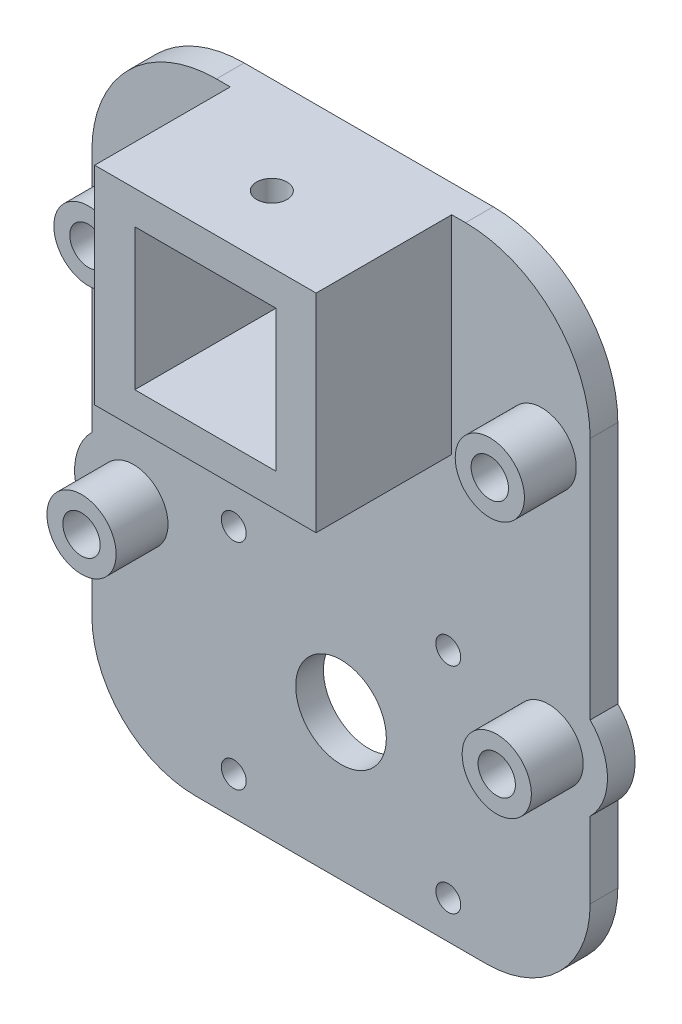
ISO-10303-21;
HEADER;
FILE_DESCRIPTION(('STEP AP214'),'2;1');
FILE_NAME('part.step','',(''),(''),'','','');
FILE_SCHEMA(('AUTOMOTIVE_DESIGN { 1 0 10303 214 1 1 1 1 }'));
ENDSEC;
DATA;
#1=APPLICATION_CONTEXT('core data for automotive mechanical design processes');
#2=APPLICATION_PROTOCOL_DEFINITION('international standard','automotive_design',2000,#1);
#3=PRODUCT_CONTEXT('',#1,'mechanical');
#4=PRODUCT('Part','Part','',(#3));
#5=PRODUCT_RELATED_PRODUCT_CATEGORY('part','',(#4));
#6=PRODUCT_DEFINITION_FORMATION('','',#4);
#7=PRODUCT_DEFINITION_CONTEXT('part definition',#1,'design');
#8=PRODUCT_DEFINITION('design','',#6,#7);
#9=PRODUCT_DEFINITION_SHAPE('','',#8);
#10=(LENGTH_UNIT() NAMED_UNIT(*) SI_UNIT(.MILLI.,.METRE.));
#11=(NAMED_UNIT(*) PLANE_ANGLE_UNIT() SI_UNIT($,.RADIAN.));
#12=(NAMED_UNIT(*) SI_UNIT($,.STERADIAN.) SOLID_ANGLE_UNIT());
#13=UNCERTAINTY_MEASURE_WITH_UNIT(LENGTH_MEASURE(1.E-05),#10,'distance_accuracy_value','');
#14=(GEOMETRIC_REPRESENTATION_CONTEXT(3) GLOBAL_UNCERTAINTY_ASSIGNED_CONTEXT((#13)) GLOBAL_UNIT_ASSIGNED_CONTEXT((#10,
#11,#12)) REPRESENTATION_CONTEXT('',''));
#15=CARTESIAN_POINT('',(0.,0.,0.));
#16=DIRECTION('',(0.,0.,1.));
#17=DIRECTION('',(1.,0.,0.));
#18=AXIS2_PLACEMENT_3D('',#15,#16,#17);
#19=CARTESIAN_POINT('',(0.,0.,4.));
#20=DIRECTION('',(0.,0.,1.));
#21=DIRECTION('',(1.,0.,0.));
#22=AXIS2_PLACEMENT_3D('',#19,#20,#21);
#23=PLANE('',#22);
#24=CARTESIAN_POINT('',(30.,-8.49999999999995,4.));
#25=DIRECTION('',(0.,0.,1.));
#26=DIRECTION('',(-1.,0.,0.));
#27=AXIS2_PLACEMENT_3D('',#24,#25,#26);
#28=CIRCLE('',#27,5.);
#29=CARTESIAN_POINT('',(25.,-8.49999999999995,4.));
#30=VERTEX_POINT('',#29);
#31=EDGE_CURVE('E401',#30,#30,#28,.T.);
#32=ORIENTED_EDGE('',*,*,#31,.F.);
#33=EDGE_LOOP('',(#32));
#34=FACE_BOUND('',#33,.T.);
#35=CARTESIAN_POINT('',(-29.,28.1,4.));
#36=DIRECTION('',(0.,0.,1.));
#37=DIRECTION('',(1.,0.,0.));
#38=AXIS2_PLACEMENT_3D('',#35,#36,#37);
#39=CIRCLE('',#38,5.);
#40=CARTESIAN_POINT('',(-24.,28.1,4.));
#41=VERTEX_POINT('',#40);
#42=EDGE_CURVE('E383',#41,#41,#39,.T.);
#43=ORIENTED_EDGE('',*,*,#42,.F.);
#44=EDGE_LOOP('',(#43));
#45=FACE_BOUND('',#44,.T.);
#46=DIRECTION('',(0.,-1.,0.));
#47=VECTOR('',#46,1.);
#48=CARTESIAN_POINT('',(-16.0000000000035,0.,4.));
#49=LINE('',#48,#47);
#50=CARTESIAN_POINT('',(-16.0000000000035,50.75,4.));
#51=VERTEX_POINT('',#50);
#52=CARTESIAN_POINT('',(-16.0000000000035,20.75,4.));
#53=VERTEX_POINT('',#52);
#54=EDGE_CURVE('E65',#51,#53,#49,.T.);
#55=ORIENTED_EDGE('',*,*,#54,.F.);
#56=DIRECTION('',(1.,0.,0.));
#57=VECTOR('',#56,1.);
#58=CARTESIAN_POINT('',(0.,50.75,4.));
#59=LINE('',#58,#57);
#60=CARTESIAN_POINT('',(-18.,50.75,4.));
#61=VERTEX_POINT('',#60);
#62=EDGE_CURVE('E317',#61,#51,#59,.T.);
#63=ORIENTED_EDGE('',*,*,#62,.F.);
#64=CARTESIAN_POINT('',(-18.,32.75,4.));
#65=DIRECTION('',(0.,0.,1.));
#66=DIRECTION('',(1.,0.,0.));
#67=AXIS2_PLACEMENT_3D('',#64,#65,#66);
#68=CIRCLE('',#67,18.);
#69=CARTESIAN_POINT('',(-36.,32.75,4.));
#70=VERTEX_POINT('',#69);
#71=EDGE_CURVE('E188',#61,#70,#68,.T.);
#72=ORIENTED_EDGE('',*,*,#71,.T.);
#73=DIRECTION('',(0.,-1.,0.));
#74=VECTOR('',#73,1.);
#75=CARTESIAN_POINT('',(-36.,0.,4.));
#76=LINE('',#75,#74);
#77=CARTESIAN_POINT('',(-36.,-2.47920271060388,4.));
#78=VERTEX_POINT('',#77);
#79=EDGE_CURVE('E180',#70,#78,#76,.T.);
#80=ORIENTED_EDGE('',*,*,#79,.T.);
#81=CARTESIAN_POINT('',(-30.,-8.49999999999995,4.));
#82=DIRECTION('',(0.,0.,1.));
#83=DIRECTION('',(1.,0.,0.));
#84=AXIS2_PLACEMENT_3D('',#81,#82,#83);
#85=CIRCLE('',#84,8.49999999999995);
#86=CARTESIAN_POINT('',(-36.,-14.520797289396,4.));
#87=VERTEX_POINT('',#86);
#88=EDGE_CURVE('E184',#78,#87,#85,.T.);
#89=ORIENTED_EDGE('',*,*,#88,.T.);
#90=CARTESIAN_POINT('',(-36.,-25.4999999999999,4.));
#91=VERTEX_POINT('',#90);
#92=EDGE_CURVE('E87',#87,#91,#76,.T.);
#93=ORIENTED_EDGE('',*,*,#92,.T.);
#94=CARTESIAN_POINT('',(-21.,-25.4999999999999,4.));
#95=DIRECTION('',(0.,0.,1.));
#96=DIRECTION('',(1.,0.,0.));
#97=AXIS2_PLACEMENT_3D('',#94,#95,#96);
#98=CIRCLE('',#97,15.);
#99=CARTESIAN_POINT('',(-20.9999999999965,-40.4999999999999,4.));
#100=VERTEX_POINT('',#99);
#101=EDGE_CURVE('E291',#91,#100,#98,.T.);
#102=ORIENTED_EDGE('',*,*,#101,.T.);
#103=DIRECTION('',(1.,0.,0.));
#104=VECTOR('',#103,1.);
#105=CARTESIAN_POINT('',(0.,-40.4999999999999,4.));
#106=LINE('',#105,#104);
#107=CARTESIAN_POINT('',(21.0000000000035,-40.4999999999999,4.));
#108=VERTEX_POINT('',#107);
#109=EDGE_CURVE('E153',#100,#108,#106,.T.);
#110=ORIENTED_EDGE('',*,*,#109,.T.);
#111=CARTESIAN_POINT('',(21.,-25.4999999999999,4.));
#112=DIRECTION('',(0.,0.,1.));
#113=DIRECTION('',(1.,0.,0.));
#114=AXIS2_PLACEMENT_3D('',#111,#112,#113);
#115=CIRCLE('',#114,15.);
#116=CARTESIAN_POINT('',(36.,-25.4999999999999,4.));
#117=VERTEX_POINT('',#116);
#118=EDGE_CURVE('E336',#117,#108,#115,.F.);
#119=ORIENTED_EDGE('',*,*,#118,.F.);
#120=DIRECTION('',(0.,-1.,0.));
#121=VECTOR('',#120,1.);
#122=CARTESIAN_POINT('',(36.,0.,4.));
#123=LINE('',#122,#121);
#124=CARTESIAN_POINT('',(36.,-14.520797289396,4.));
#125=VERTEX_POINT('',#124);
#126=EDGE_CURVE('E333',#125,#117,#123,.T.);
#127=ORIENTED_EDGE('',*,*,#126,.F.);
#128=CARTESIAN_POINT('',(30.,-8.49999999999995,4.));
#129=DIRECTION('',(0.,0.,1.));
#130=DIRECTION('',(1.,0.,0.));
#131=AXIS2_PLACEMENT_3D('',#128,#129,#130);
#132=CIRCLE('',#131,8.49999999999995);
#133=CARTESIAN_POINT('',(36.,-2.47920271060388,4.));
#134=VERTEX_POINT('',#133);
#135=EDGE_CURVE('E330',#134,#125,#132,.F.);
#136=ORIENTED_EDGE('',*,*,#135,.F.);
#137=CARTESIAN_POINT('',(36.,32.75,4.));
#138=VERTEX_POINT('',#137);
#139=EDGE_CURVE('E329',#138,#134,#123,.T.);
#140=ORIENTED_EDGE('',*,*,#139,.F.);
#141=CARTESIAN_POINT('',(18.,32.75,4.));
#142=DIRECTION('',(0.,0.,1.));
#143=DIRECTION('',(1.,0.,0.));
#144=AXIS2_PLACEMENT_3D('',#141,#142,#143);
#145=CIRCLE('',#144,18.);
#146=CARTESIAN_POINT('',(18.,50.75,4.));
#147=VERTEX_POINT('',#146);
#148=EDGE_CURVE('E325',#147,#138,#145,.F.);
#149=ORIENTED_EDGE('',*,*,#148,.F.);
#150=CARTESIAN_POINT('',(15.9999999999965,50.75,4.));
#151=VERTEX_POINT('',#150);
#152=EDGE_CURVE('E321',#151,#147,#59,.T.);
#153=ORIENTED_EDGE('',*,*,#152,.F.);
#154=DIRECTION('',(0.,-1.,0.));
#155=VECTOR('',#154,1.);
#156=CARTESIAN_POINT('',(15.9999999999965,0.,4.));
#157=LINE('',#156,#155);
#158=CARTESIAN_POINT('',(15.9999999999965,20.75,4.));
#159=VERTEX_POINT('',#158);
#160=EDGE_CURVE('E348',#151,#159,#157,.T.);
#161=ORIENTED_EDGE('',*,*,#160,.T.);
#162=DIRECTION('',(-1.,0.,0.));
#163=VECTOR('',#162,1.);
#164=CARTESIAN_POINT('',(0.,20.75,4.));
#165=LINE('',#164,#163);
#166=EDGE_CURVE('E346',#159,#53,#165,.T.);
#167=ORIENTED_EDGE('',*,*,#166,.T.);
#168=EDGE_LOOP('',(#55,#63,#72,#80,#89,#93,#102,#110,#119,#127,#136,#140,#149,#153,#161,#167));
#169=FACE_BOUND('',#168,.T.);
#170=CARTESIAN_POINT('',(-15.4999999999965,-3.99999999999994,4.));
#171=DIRECTION('',(0.,0.,1.));
#172=DIRECTION('',(1.,0.,0.));
#173=AXIS2_PLACEMENT_3D('',#170,#171,#172);
#174=CIRCLE('',#173,1.8);
#175=CARTESIAN_POINT('',(-13.6999999999965,-3.99999999999994,4.));
#176=VERTEX_POINT('',#175);
#177=EDGE_CURVE('E206',#176,#176,#174,.T.);
#178=ORIENTED_EDGE('',*,*,#177,.F.);
#179=EDGE_LOOP('',(#178));
#180=FACE_BOUND('',#179,.T.);
#181=CARTESIAN_POINT('',(-15.4999999999965,-35.,4.));
#182=DIRECTION('',(0.,0.,1.));
#183=DIRECTION('',(1.,0.,0.));
#184=AXIS2_PLACEMENT_3D('',#181,#182,#183);
#185=CIRCLE('',#184,1.8);
#186=CARTESIAN_POINT('',(-13.6999999999965,-35.,4.));
#187=VERTEX_POINT('',#186);
#188=EDGE_CURVE('E211',#187,#187,#185,.T.);
#189=ORIENTED_EDGE('',*,*,#188,.F.);
#190=EDGE_LOOP('',(#189));
#191=FACE_BOUND('',#190,.T.);
#192=CARTESIAN_POINT('',(15.5000000000035,-34.9999999999999,4.));
#193=DIRECTION('',(0.,0.,1.));
#194=DIRECTION('',(1.,0.,0.));
#195=AXIS2_PLACEMENT_3D('',#192,#193,#194);
#196=CIRCLE('',#195,1.8);
#197=CARTESIAN_POINT('',(17.3000000000035,-34.9999999999999,4.));
#198=VERTEX_POINT('',#197);
#199=EDGE_CURVE('E214',#198,#198,#196,.T.);
#200=ORIENTED_EDGE('',*,*,#199,.F.);
#201=EDGE_LOOP('',(#200));
#202=FACE_BOUND('',#201,.T.);
#203=CARTESIAN_POINT('',(15.5000000000035,-3.99999999999994,4.));
#204=DIRECTION('',(0.,0.,1.));
#205=DIRECTION('',(1.,0.,0.));
#206=AXIS2_PLACEMENT_3D('',#203,#204,#205);
#207=CIRCLE('',#206,1.8);
#208=CARTESIAN_POINT('',(17.3000000000035,-3.99999999999994,4.));
#209=VERTEX_POINT('',#208);
#210=EDGE_CURVE('E217',#209,#209,#207,.T.);
#211=ORIENTED_EDGE('',*,*,#210,.F.);
#212=EDGE_LOOP('',(#211));
#213=FACE_BOUND('',#212,.T.);
#214=CARTESIAN_POINT('',(3.49145625605507E-12,-19.4999999999999,4.));
#215=DIRECTION('',(0.,0.,1.));
#216=DIRECTION('',(1.,0.,0.));
#217=AXIS2_PLACEMENT_3D('',#214,#215,#216);
#218=CIRCLE('',#217,6.55);
#219=CARTESIAN_POINT('',(6.55000000000349,-19.4999999999999,4.));
#220=VERTEX_POINT('',#219);
#221=EDGE_CURVE('E220',#220,#220,#218,.T.);
#222=ORIENTED_EDGE('',*,*,#221,.F.);
#223=EDGE_LOOP('',(#222));
#224=FACE_BOUND('',#223,.T.);
#225=CARTESIAN_POINT('',(-30.,-8.49999999999995,4.));
#226=DIRECTION('',(0.,0.,1.));
#227=DIRECTION('',(1.,0.,0.));
#228=AXIS2_PLACEMENT_3D('',#225,#226,#227);
#229=CIRCLE('',#228,5.);
#230=CARTESIAN_POINT('',(-25.,-8.49999999999995,4.));
#231=VERTEX_POINT('',#230);
#232=EDGE_CURVE('E392',#231,#231,#229,.T.);
#233=ORIENTED_EDGE('',*,*,#232,.F.);
#234=EDGE_LOOP('',(#233));
#235=FACE_BOUND('',#234,.T.);
#236=CARTESIAN_POINT('',(29.,28.1,4.));
#237=DIRECTION('',(0.,0.,1.));
#238=DIRECTION('',(-1.,0.,0.));
#239=AXIS2_PLACEMENT_3D('',#236,#237,#238);
#240=CIRCLE('',#239,5.00000000000002);
#241=CARTESIAN_POINT('',(24.,28.1,4.));
#242=VERTEX_POINT('',#241);
#243=EDGE_CURVE('E410',#242,#242,#240,.T.);
#244=ORIENTED_EDGE('',*,*,#243,.F.);
#245=EDGE_LOOP('',(#244));
#246=FACE_BOUND('',#245,.T.);
#247=ADVANCED_FACE('F61',(#34,#45,#169,#180,#191,#202,#213,#224,#235,#246),#23,.T.);
#248=CARTESIAN_POINT('',(10.2,0.,4.));
#249=DIRECTION('',(-1.,0.,0.));
#250=DIRECTION('',(0.,0.,1.));
#251=AXIS2_PLACEMENT_3D('',#248,#249,#250);
#252=PLANE('',#251);
#253=DIRECTION('',(0.,1.,0.));
#254=VECTOR('',#253,1.);
#255=CARTESIAN_POINT('',(10.2,0.,0.));
#256=LINE('',#255,#254);
#257=CARTESIAN_POINT('',(10.2,25.55,0.));
#258=VERTEX_POINT('',#257);
#259=CARTESIAN_POINT('',(10.2,45.95,0.));
#260=VERTEX_POINT('',#259);
#261=EDGE_CURVE('E253',#258,#260,#256,.T.);
#262=ORIENTED_EDGE('',*,*,#261,.F.);
#263=DIRECTION('',(0.,0.,-1.));
#264=VECTOR('',#263,1.);
#265=CARTESIAN_POINT('',(10.2,25.55,4.));
#266=LINE('',#265,#264);
#267=CARTESIAN_POINT('',(10.2,25.55,23.6));
#268=VERTEX_POINT('',#267);
#269=EDGE_CURVE('E12',#268,#258,#266,.T.);
#270=ORIENTED_EDGE('',*,*,#269,.F.);
#271=DIRECTION('',(0.,-1.,0.));
#272=VECTOR('',#271,1.);
#273=CARTESIAN_POINT('',(10.2,0.,23.6));
#274=LINE('',#273,#272);
#275=CARTESIAN_POINT('',(10.2,45.95,23.6));
#276=VERTEX_POINT('',#275);
#277=EDGE_CURVE('E364',#276,#268,#274,.T.);
#278=ORIENTED_EDGE('',*,*,#277,.F.);
#279=DIRECTION('',(0.,0.,-1.));
#280=VECTOR('',#279,1.);
#281=CARTESIAN_POINT('',(10.2,45.95,4.));
#282=LINE('',#281,#280);
#283=EDGE_CURVE('E144',#276,#260,#282,.T.);
#284=ORIENTED_EDGE('',*,*,#283,.T.);
#285=EDGE_LOOP('',(#262,#270,#278,#284));
#286=FACE_BOUND('',#285,.T.);
#287=ADVANCED_FACE('F437',(#286),#252,.T.);
#288=CARTESIAN_POINT('',(0.,25.55,4.));
#289=DIRECTION('',(0.,1.,0.));
#290=DIRECTION('',(0.,0.,1.));
#291=AXIS2_PLACEMENT_3D('',#288,#289,#290);
#292=PLANE('',#291);
#293=DIRECTION('',(1.,0.,0.));
#294=VECTOR('',#293,1.);
#295=CARTESIAN_POINT('',(0.,25.55,0.));
#296=LINE('',#295,#294);
#297=CARTESIAN_POINT('',(-10.2,25.55,0.));
#298=VERTEX_POINT('',#297);
#299=EDGE_CURVE('E256',#298,#258,#296,.T.);
#300=ORIENTED_EDGE('',*,*,#299,.F.);
#301=DIRECTION('',(0.,0.,-1.));
#302=VECTOR('',#301,1.);
#303=CARTESIAN_POINT('',(-10.2,25.55,4.));
#304=LINE('',#303,#302);
#305=CARTESIAN_POINT('',(-10.2,25.55,23.6));
#306=VERTEX_POINT('',#305);
#307=EDGE_CURVE('E71',#306,#298,#304,.T.);
#308=ORIENTED_EDGE('',*,*,#307,.F.);
#309=DIRECTION('',(-1.,0.,0.));
#310=VECTOR('',#309,1.);
#311=CARTESIAN_POINT('',(0.,25.55,23.6));
#312=LINE('',#311,#310);
#313=EDGE_CURVE('E367',#268,#306,#312,.T.);
#314=ORIENTED_EDGE('',*,*,#313,.F.);
#315=ORIENTED_EDGE('',*,*,#269,.T.);
#316=EDGE_LOOP('',(#300,#308,#314,#315));
#317=FACE_BOUND('',#316,.T.);
#318=ADVANCED_FACE('F443',(#317),#292,.T.);
#319=CARTESIAN_POINT('',(-10.2,0.,4.));
#320=DIRECTION('',(-1.,0.,0.));
#321=DIRECTION('',(0.,0.,1.));
#322=AXIS2_PLACEMENT_3D('',#319,#320,#321);
#323=PLANE('',#322);
#324=DIRECTION('',(0.,1.,0.));
#325=VECTOR('',#324,1.);
#326=CARTESIAN_POINT('',(-10.2,0.,0.));
#327=LINE('',#326,#325);
#328=CARTESIAN_POINT('',(-10.2,45.95,0.));
#329=VERTEX_POINT('',#328);
#330=EDGE_CURVE('E259',#298,#329,#327,.T.);
#331=ORIENTED_EDGE('',*,*,#330,.T.);
#332=DIRECTION('',(0.,0.,-1.));
#333=VECTOR('',#332,1.);
#334=CARTESIAN_POINT('',(-10.2,45.95,4.));
#335=LINE('',#334,#333);
#336=CARTESIAN_POINT('',(-10.2,45.95,23.6));
#337=VERTEX_POINT('',#336);
#338=EDGE_CURVE('E293',#337,#329,#335,.T.);
#339=ORIENTED_EDGE('',*,*,#338,.F.);
#340=DIRECTION('',(0.,-1.,0.));
#341=VECTOR('',#340,1.);
#342=CARTESIAN_POINT('',(-10.2,0.,23.6));
#343=LINE('',#342,#341);
#344=EDGE_CURVE('E370',#337,#306,#343,.T.);
#345=ORIENTED_EDGE('',*,*,#344,.T.);
#346=ORIENTED_EDGE('',*,*,#307,.T.);
#347=EDGE_LOOP('',(#331,#339,#345,#346));
#348=FACE_BOUND('',#347,.T.);
#349=ADVANCED_FACE('F496',(#348),#323,.F.);
#350=CARTESIAN_POINT('',(-21.,-25.4999999999999,4.));
#351=DIRECTION('',(0.,0.,-1.));
#352=DIRECTION('',(-1.,0.,0.));
#353=AXIS2_PLACEMENT_3D('',#350,#351,#352);
#354=CYLINDRICAL_SURFACE('',#353,15.);
#355=CARTESIAN_POINT('',(-21.,-25.4999999999999,0.));
#356=DIRECTION('',(0.,0.,1.));
#357=DIRECTION('',(1.,0.,0.));
#358=AXIS2_PLACEMENT_3D('',#355,#356,#357);
#359=CIRCLE('',#358,15.);
#360=CARTESIAN_POINT('',(-36.,-25.4999999999999,0.));
#361=VERTEX_POINT('',#360);
#362=CARTESIAN_POINT('',(-20.9999999999965,-40.4999999999999,0.));
#363=VERTEX_POINT('',#362);
#364=EDGE_CURVE('E224',#361,#363,#359,.T.);
#365=ORIENTED_EDGE('',*,*,#364,.T.);
#366=DIRECTION('',(0.,0.,-1.));
#367=VECTOR('',#366,1.);
#368=CARTESIAN_POINT('',(-20.9999999999965,-40.4999999999999,4.));
#369=LINE('',#368,#367);
#370=EDGE_CURVE('E294',#100,#363,#369,.T.);
#371=ORIENTED_EDGE('',*,*,#370,.F.);
#372=ORIENTED_EDGE('',*,*,#101,.F.);
#373=DIRECTION('',(0.,0.,-1.));
#374=VECTOR('',#373,1.);
#375=CARTESIAN_POINT('',(-36.,-25.4999999999999,4.));
#376=LINE('',#375,#374);
#377=EDGE_CURVE('E223',#91,#361,#376,.T.);
#378=ORIENTED_EDGE('',*,*,#377,.T.);
#379=EDGE_LOOP('',(#365,#371,#372,#378));
#380=FACE_BOUND('',#379,.T.);
#381=ADVANCED_FACE('F63',(#380),#354,.T.);
#382=CARTESIAN_POINT('',(0.,-40.4999999999999,4.));
#383=DIRECTION('',(0.,1.,0.));
#384=DIRECTION('',(0.,0.,1.));
#385=AXIS2_PLACEMENT_3D('',#382,#383,#384);
#386=PLANE('',#385);
#387=DIRECTION('',(1.,0.,0.));
#388=VECTOR('',#387,1.);
#389=CARTESIAN_POINT('',(0.,-40.4999999999999,0.));
#390=LINE('',#389,#388);
#391=CARTESIAN_POINT('',(21.0000000000035,-40.4999999999999,0.));
#392=VERTEX_POINT('',#391);
#393=EDGE_CURVE('E227',#363,#392,#390,.T.);
#394=ORIENTED_EDGE('',*,*,#393,.T.);
#395=DIRECTION('',(0.,0.,-1.));
#396=VECTOR('',#395,1.);
#397=CARTESIAN_POINT('',(21.0000000000035,-40.4999999999999,4.));
#398=LINE('',#397,#396);
#399=EDGE_CURVE('E314',#108,#392,#398,.T.);
#400=ORIENTED_EDGE('',*,*,#399,.F.);
#401=ORIENTED_EDGE('',*,*,#109,.F.);
#402=ORIENTED_EDGE('',*,*,#370,.T.);
#403=EDGE_LOOP('',(#394,#400,#401,#402));
#404=FACE_BOUND('',#403,.T.);
#405=ADVANCED_FACE('F531',(#404),#386,.F.);
#406=CARTESIAN_POINT('',(21.,-25.4999999999999,4.));
#407=DIRECTION('',(0.,0.,-1.));
#408=DIRECTION('',(-1.,0.,0.));
#409=AXIS2_PLACEMENT_3D('',#406,#407,#408);
#410=CYLINDRICAL_SURFACE('',#409,15.);
#411=CARTESIAN_POINT('',(21.,-25.4999999999999,0.));
#412=DIRECTION('',(0.,0.,1.));
#413=DIRECTION('',(1.,0.,0.));
#414=AXIS2_PLACEMENT_3D('',#411,#412,#413);
#415=CIRCLE('',#414,15.);
#416=CARTESIAN_POINT('',(36.,-25.4999999999999,0.));
#417=VERTEX_POINT('',#416);
#418=EDGE_CURVE('E231',#417,#392,#415,.F.);
#419=ORIENTED_EDGE('',*,*,#418,.F.);
#420=DIRECTION('',(0.,0.,-1.));
#421=VECTOR('',#420,1.);
#422=CARTESIAN_POINT('',(36.,-25.4999999999999,4.));
#423=LINE('',#422,#421);
#424=EDGE_CURVE('E312',#117,#417,#423,.T.);
#425=ORIENTED_EDGE('',*,*,#424,.F.);
#426=ORIENTED_EDGE('',*,*,#118,.T.);
#427=ORIENTED_EDGE('',*,*,#399,.T.);
#428=EDGE_LOOP('',(#419,#425,#426,#427));
#429=FACE_BOUND('',#428,.T.);
#430=ADVANCED_FACE('F529',(#429),#410,.T.);
#431=CARTESIAN_POINT('',(36.,0.,4.));
#432=DIRECTION('',(1.,0.,0.));
#433=DIRECTION('',(0.,1.,0.));
#434=AXIS2_PLACEMENT_3D('',#431,#432,#433);
#435=PLANE('',#434);
#436=DIRECTION('',(0.,-1.,0.));
#437=VECTOR('',#436,1.);
#438=CARTESIAN_POINT('',(36.,0.,0.));
#439=LINE('',#438,#437);
#440=CARTESIAN_POINT('',(36.,-14.520797289396,0.));
#441=VERTEX_POINT('',#440);
#442=EDGE_CURVE('E234',#441,#417,#439,.T.);
#443=ORIENTED_EDGE('',*,*,#442,.F.);
#444=DIRECTION('',(0.,0.,-1.));
#445=VECTOR('',#444,1.);
#446=CARTESIAN_POINT('',(36.,-14.520797289396,4.));
#447=LINE('',#446,#445);
#448=EDGE_CURVE('E310',#125,#441,#447,.T.);
#449=ORIENTED_EDGE('',*,*,#448,.F.);
#450=ORIENTED_EDGE('',*,*,#126,.T.);
#451=ORIENTED_EDGE('',*,*,#424,.T.);
#452=EDGE_LOOP('',(#443,#449,#450,#451));
#453=FACE_BOUND('',#452,.T.);
#454=ADVANCED_FACE('F525',(#453),#435,.T.);
#455=CARTESIAN_POINT('',(30.,-8.49999999999995,4.));
#456=DIRECTION('',(0.,0.,-1.));
#457=DIRECTION('',(-1.,0.,0.));
#458=AXIS2_PLACEMENT_3D('',#455,#456,#457);
#459=CYLINDRICAL_SURFACE('',#458,8.49999999999995);
#460=CARTESIAN_POINT('',(30.,-8.49999999999995,0.));
#461=DIRECTION('',(0.,0.,1.));
#462=DIRECTION('',(1.,0.,0.));
#463=AXIS2_PLACEMENT_3D('',#460,#461,#462);
#464=CIRCLE('',#463,8.49999999999995);
#465=CARTESIAN_POINT('',(36.,-2.47920271060388,0.));
#466=VERTEX_POINT('',#465);
#467=EDGE_CURVE('E237',#466,#441,#464,.F.);
#468=ORIENTED_EDGE('',*,*,#467,.F.);
#469=DIRECTION('',(0.,0.,-1.));
#470=VECTOR('',#469,1.);
#471=CARTESIAN_POINT('',(36.,-2.47920271060388,4.));
#472=LINE('',#471,#470);
#473=EDGE_CURVE('E308',#134,#466,#472,.T.);
#474=ORIENTED_EDGE('',*,*,#473,.F.);
#475=ORIENTED_EDGE('',*,*,#135,.T.);
#476=ORIENTED_EDGE('',*,*,#448,.T.);
#477=EDGE_LOOP('',(#468,#474,#475,#476));
#478=FACE_BOUND('',#477,.T.);
#479=ADVANCED_FACE('F523',(#478),#459,.T.);
#480=CARTESIAN_POINT('',(36.,32.75,0.));
#481=VERTEX_POINT('',#480);
#482=EDGE_CURVE('E238',#481,#466,#439,.T.);
#483=ORIENTED_EDGE('',*,*,#482,.F.);
#484=DIRECTION('',(0.,0.,-1.));
#485=VECTOR('',#484,1.);
#486=CARTESIAN_POINT('',(36.,32.75,4.));
#487=LINE('',#486,#485);
#488=EDGE_CURVE('E306',#138,#481,#487,.T.);
#489=ORIENTED_EDGE('',*,*,#488,.F.);
#490=ORIENTED_EDGE('',*,*,#139,.T.);
#491=ORIENTED_EDGE('',*,*,#473,.T.);
#492=EDGE_LOOP('',(#483,#489,#490,#491));
#493=FACE_BOUND('',#492,.T.);
#494=ADVANCED_FACE('F519',(#493),#435,.T.);
#495=CARTESIAN_POINT('',(18.,32.75,4.));
#496=DIRECTION('',(0.,0.,-1.));
#497=DIRECTION('',(-1.,0.,0.));
#498=AXIS2_PLACEMENT_3D('',#495,#496,#497);
#499=CYLINDRICAL_SURFACE('',#498,18.);
#500=CARTESIAN_POINT('',(18.,32.75,0.));
#501=DIRECTION('',(0.,0.,1.));
#502=DIRECTION('',(1.,0.,0.));
#503=AXIS2_PLACEMENT_3D('',#500,#501,#502);
#504=CIRCLE('',#503,18.);
#505=CARTESIAN_POINT('',(18.,50.75,0.));
#506=VERTEX_POINT('',#505);
#507=EDGE_CURVE('E241',#506,#481,#504,.F.);
#508=ORIENTED_EDGE('',*,*,#507,.F.);
#509=DIRECTION('',(0.,0.,-1.));
#510=VECTOR('',#509,1.);
#511=CARTESIAN_POINT('',(18.,50.75,4.));
#512=LINE('',#511,#510);
#513=EDGE_CURVE('E304',#147,#506,#512,.T.);
#514=ORIENTED_EDGE('',*,*,#513,.F.);
#515=ORIENTED_EDGE('',*,*,#148,.T.);
#516=ORIENTED_EDGE('',*,*,#488,.T.);
#517=EDGE_LOOP('',(#508,#514,#515,#516));
#518=FACE_BOUND('',#517,.T.);
#519=ADVANCED_FACE('F515',(#518),#499,.T.);
#520=CARTESIAN_POINT('',(0.,50.75,4.));
#521=DIRECTION('',(0.,1.,0.));
#522=DIRECTION('',(0.,0.,1.));
#523=AXIS2_PLACEMENT_3D('',#520,#521,#522);
#524=PLANE('',#523);
#525=CARTESIAN_POINT('',(0.,50.75,14.));
#526=DIRECTION('',(0.,1.,0.));
#527=DIRECTION('',(0.,0.,1.));
#528=AXIS2_PLACEMENT_3D('',#525,#526,#527);
#529=CIRCLE('',#528,2.2);
#530=CARTESIAN_POINT('',(0.,50.75,16.2));
#531=VERTEX_POINT('',#530);
#532=EDGE_CURVE('E377',#531,#531,#529,.T.);
#533=ORIENTED_EDGE('',*,*,#532,.F.);
#534=EDGE_LOOP('',(#533));
#535=FACE_BOUND('',#534,.T.);
#536=DIRECTION('',(1.,0.,0.));
#537=VECTOR('',#536,1.);
#538=CARTESIAN_POINT('',(0.,50.75,0.));
#539=LINE('',#538,#537);
#540=CARTESIAN_POINT('',(-18.,50.75,0.));
#541=VERTEX_POINT('',#540);
#542=EDGE_CURVE('E244',#541,#506,#539,.T.);
#543=ORIENTED_EDGE('',*,*,#542,.F.);
#544=DIRECTION('',(0.,0.,-1.));
#545=VECTOR('',#544,1.);
#546=CARTESIAN_POINT('',(-18.,50.75,4.));
#547=LINE('',#546,#545);
#548=EDGE_CURVE('E302',#61,#541,#547,.T.);
#549=ORIENTED_EDGE('',*,*,#548,.F.);
#550=ORIENTED_EDGE('',*,*,#62,.T.);
#551=DIRECTION('',(0.,0.,-1.));
#552=VECTOR('',#551,1.);
#553=CARTESIAN_POINT('',(-16.0000000000035,50.75,23.6));
#554=LINE('',#553,#552);
#555=CARTESIAN_POINT('',(-16.0000000000035,50.75,23.6));
#556=VERTEX_POINT('',#555);
#557=EDGE_CURVE('E354',#556,#51,#554,.T.);
#558=ORIENTED_EDGE('',*,*,#557,.F.);
#559=DIRECTION('',(-1.,0.,0.));
#560=VECTOR('',#559,1.);
#561=CARTESIAN_POINT('',(0.,50.75,23.6));
#562=LINE('',#561,#560);
#563=CARTESIAN_POINT('',(15.9999999999965,50.75,23.6));
#564=VERTEX_POINT('',#563);
#565=EDGE_CURVE('E351',#564,#556,#562,.T.);
#566=ORIENTED_EDGE('',*,*,#565,.F.);
#567=DIRECTION('',(0.,0.,-1.));
#568=VECTOR('',#567,1.);
#569=CARTESIAN_POINT('',(15.9999999999965,50.75,23.6));
#570=LINE('',#569,#568);
#571=EDGE_CURVE('E345',#564,#151,#570,.T.);
#572=ORIENTED_EDGE('',*,*,#571,.T.);
#573=ORIENTED_EDGE('',*,*,#152,.T.);
#574=ORIENTED_EDGE('',*,*,#513,.T.);
#575=EDGE_LOOP('',(#543,#549,#550,#558,#566,#572,#573,#574));
#576=FACE_BOUND('',#575,.T.);
#577=ADVANCED_FACE('F511',(#535,#576),#524,.T.);
#578=CARTESIAN_POINT('',(-18.,32.75,4.));
#579=DIRECTION('',(0.,0.,-1.));
#580=DIRECTION('',(-1.,0.,0.));
#581=AXIS2_PLACEMENT_3D('',#578,#579,#580);
#582=CYLINDRICAL_SURFACE('',#581,18.);
#583=CARTESIAN_POINT('',(-18.,32.75,0.));
#584=DIRECTION('',(0.,0.,1.));
#585=DIRECTION('',(1.,0.,0.));
#586=AXIS2_PLACEMENT_3D('',#583,#584,#585);
#587=CIRCLE('',#586,18.);
#588=CARTESIAN_POINT('',(-36.,32.75,0.));
#589=VERTEX_POINT('',#588);
#590=EDGE_CURVE('E247',#541,#589,#587,.T.);
#591=ORIENTED_EDGE('',*,*,#590,.T.);
#592=DIRECTION('',(0.,0.,-1.));
#593=VECTOR('',#592,1.);
#594=CARTESIAN_POINT('',(-36.,32.75,4.));
#595=LINE('',#594,#593);
#596=EDGE_CURVE('E200',#70,#589,#595,.T.);
#597=ORIENTED_EDGE('',*,*,#596,.F.);
#598=ORIENTED_EDGE('',*,*,#71,.F.);
#599=ORIENTED_EDGE('',*,*,#548,.T.);
#600=EDGE_LOOP('',(#591,#597,#598,#599));
#601=FACE_BOUND('',#600,.T.);
#602=ADVANCED_FACE('F508',(#601),#582,.T.);
#603=CARTESIAN_POINT('',(-36.,0.,4.));
#604=DIRECTION('',(1.,0.,0.));
#605=DIRECTION('',(0.,0.,-1.));
#606=AXIS2_PLACEMENT_3D('',#603,#604,#605);
#607=PLANE('',#606);
#608=DIRECTION('',(0.,-1.,0.));
#609=VECTOR('',#608,1.);
#610=CARTESIAN_POINT('',(-36.,0.,0.));
#611=LINE('',#610,#609);
#612=CARTESIAN_POINT('',(-36.,-2.47920271060388,0.));
#613=VERTEX_POINT('',#612);
#614=EDGE_CURVE('E197',#589,#613,#611,.T.);
#615=ORIENTED_EDGE('',*,*,#614,.T.);
#616=DIRECTION('',(0.,0.,-1.));
#617=VECTOR('',#616,1.);
#618=CARTESIAN_POINT('',(-36.,-2.47920271060388,4.));
#619=LINE('',#618,#617);
#620=EDGE_CURVE('E194',#78,#613,#619,.T.);
#621=ORIENTED_EDGE('',*,*,#620,.F.);
#622=ORIENTED_EDGE('',*,*,#79,.F.);
#623=ORIENTED_EDGE('',*,*,#596,.T.);
#624=EDGE_LOOP('',(#615,#621,#622,#623));
#625=FACE_BOUND('',#624,.T.);
#626=ADVANCED_FACE('F195',(#625),#607,.F.);
#627=CARTESIAN_POINT('',(-30.,-8.49999999999995,4.));
#628=DIRECTION('',(0.,0.,-1.));
#629=DIRECTION('',(-1.,0.,0.));
#630=AXIS2_PLACEMENT_3D('',#627,#628,#629);
#631=CYLINDRICAL_SURFACE('',#630,8.49999999999995);
#632=CARTESIAN_POINT('',(-30.,-8.49999999999995,0.));
#633=DIRECTION('',(0.,0.,1.));
#634=DIRECTION('',(1.,0.,0.));
#635=AXIS2_PLACEMENT_3D('',#632,#633,#634);
#636=CIRCLE('',#635,8.49999999999995);
#637=CARTESIAN_POINT('',(-36.,-14.520797289396,0.));
#638=VERTEX_POINT('',#637);
#639=EDGE_CURVE('E250',#613,#638,#636,.T.);
#640=ORIENTED_EDGE('',*,*,#639,.T.);
#641=DIRECTION('',(0.,0.,-1.));
#642=VECTOR('',#641,1.);
#643=CARTESIAN_POINT('',(-36.,-14.520797289396,4.));
#644=LINE('',#643,#642);
#645=EDGE_CURVE('E201',#87,#638,#644,.T.);
#646=ORIENTED_EDGE('',*,*,#645,.F.);
#647=ORIENTED_EDGE('',*,*,#88,.F.);
#648=ORIENTED_EDGE('',*,*,#620,.T.);
#649=EDGE_LOOP('',(#640,#646,#647,#648));
#650=FACE_BOUND('',#649,.T.);
#651=ADVANCED_FACE('F203',(#650),#631,.T.);
#652=CARTESIAN_POINT('',(-30.,-8.49999999999995,4.));
#653=DIRECTION('',(0.,0.,-1.));
#654=DIRECTION('',(-1.,0.,0.));
#655=AXIS2_PLACEMENT_3D('',#652,#653,#654);
#656=CYLINDRICAL_SURFACE('',#655,2.7);
#657=CARTESIAN_POINT('',(-30.,-8.49999999999995,0.));
#658=DIRECTION('',(0.,0.,1.));
#659=DIRECTION('',(1.,0.,0.));
#660=AXIS2_PLACEMENT_3D('',#657,#658,#659);
#661=CIRCLE('',#660,2.7);
#662=CARTESIAN_POINT('',(-27.3,-8.49999999999995,0.));
#663=VERTEX_POINT('',#662);
#664=EDGE_CURVE('E285',#663,#663,#661,.T.);
#665=ORIENTED_EDGE('',*,*,#664,.F.);
#666=EDGE_LOOP('',(#665));
#667=FACE_BOUND('',#666,.T.);
#668=CARTESIAN_POINT('',(-30.,-8.49999999999995,11.5));
#669=DIRECTION('',(0.,0.,1.));
#670=DIRECTION('',(1.,0.,0.));
#671=AXIS2_PLACEMENT_3D('',#668,#669,#670);
#672=CIRCLE('',#671,2.7);
#673=CARTESIAN_POINT('',(-27.3,-8.49999999999995,11.5));
#674=VERTEX_POINT('',#673);
#675=EDGE_CURVE('E395',#674,#674,#672,.T.);
#676=ORIENTED_EDGE('',*,*,#675,.T.);
#677=EDGE_LOOP('',(#676));
#678=FACE_BOUND('',#677,.T.);
#679=ADVANCED_FACE('F461',(#667,#678),#656,.F.);
#680=CARTESIAN_POINT('',(3.49145625605507E-12,-19.4999999999999,4.));
#681=DIRECTION('',(0.,0.,-1.));
#682=DIRECTION('',(-1.,0.,0.));
#683=AXIS2_PLACEMENT_3D('',#680,#681,#682);
#684=CYLINDRICAL_SURFACE('',#683,6.55);
#685=ORIENTED_EDGE('',*,*,#221,.T.);
#686=EDGE_LOOP('',(#685));
#687=FACE_BOUND('',#686,.T.);
#688=CARTESIAN_POINT('',(3.49145625605507E-12,-19.4999999999999,0.));
#689=DIRECTION('',(0.,0.,1.));
#690=DIRECTION('',(1.,0.,0.));
#691=AXIS2_PLACEMENT_3D('',#688,#689,#690);
#692=CIRCLE('',#691,6.55);
#693=CARTESIAN_POINT('',(6.55000000000349,-19.4999999999999,0.));
#694=VERTEX_POINT('',#693);
#695=EDGE_CURVE('E282',#694,#694,#692,.T.);
#696=ORIENTED_EDGE('',*,*,#695,.F.);
#697=EDGE_LOOP('',(#696));
#698=FACE_BOUND('',#697,.T.);
#699=ADVANCED_FACE('F464',(#687,#698),#684,.F.);
#700=CARTESIAN_POINT('',(15.5000000000035,-3.99999999999994,4.));
#701=DIRECTION('',(0.,0.,-1.));
#702=DIRECTION('',(-1.,0.,0.));
#703=AXIS2_PLACEMENT_3D('',#700,#701,#702);
#704=CYLINDRICAL_SURFACE('',#703,1.8);
#705=ORIENTED_EDGE('',*,*,#210,.T.);
#706=EDGE_LOOP('',(#705));
#707=FACE_BOUND('',#706,.T.);
#708=CARTESIAN_POINT('',(15.5000000000035,-3.99999999999994,0.));
#709=DIRECTION('',(0.,0.,1.));
#710=DIRECTION('',(1.,0.,0.));
#711=AXIS2_PLACEMENT_3D('',#708,#709,#710);
#712=CIRCLE('',#711,1.8);
#713=CARTESIAN_POINT('',(17.3000000000035,-3.99999999999994,0.));
#714=VERTEX_POINT('',#713);
#715=EDGE_CURVE('E279',#714,#714,#712,.T.);
#716=ORIENTED_EDGE('',*,*,#715,.F.);
#717=EDGE_LOOP('',(#716));
#718=FACE_BOUND('',#717,.T.);
#719=ADVANCED_FACE('F468',(#707,#718),#704,.F.);
#720=CARTESIAN_POINT('',(15.5000000000035,-34.9999999999999,4.));
#721=DIRECTION('',(0.,0.,-1.));
#722=DIRECTION('',(-1.,0.,0.));
#723=AXIS2_PLACEMENT_3D('',#720,#721,#722);
#724=CYLINDRICAL_SURFACE('',#723,1.8);
#725=ORIENTED_EDGE('',*,*,#199,.T.);
#726=EDGE_LOOP('',(#725));
#727=FACE_BOUND('',#726,.T.);
#728=CARTESIAN_POINT('',(15.5000000000035,-34.9999999999999,0.));
#729=DIRECTION('',(0.,0.,1.));
#730=DIRECTION('',(1.,0.,0.));
#731=AXIS2_PLACEMENT_3D('',#728,#729,#730);
#732=CIRCLE('',#731,1.8);
#733=CARTESIAN_POINT('',(17.3000000000035,-34.9999999999999,0.));
#734=VERTEX_POINT('',#733);
#735=EDGE_CURVE('E276',#734,#734,#732,.T.);
#736=ORIENTED_EDGE('',*,*,#735,.F.);
#737=EDGE_LOOP('',(#736));
#738=FACE_BOUND('',#737,.T.);
#739=ADVANCED_FACE('F472',(#727,#738),#724,.F.);
#740=CARTESIAN_POINT('',(-15.4999999999965,-35.,4.));
#741=DIRECTION('',(0.,0.,-1.));
#742=DIRECTION('',(-1.,0.,0.));
#743=AXIS2_PLACEMENT_3D('',#740,#741,#742);
#744=CYLINDRICAL_SURFACE('',#743,1.8);
#745=ORIENTED_EDGE('',*,*,#188,.T.);
#746=EDGE_LOOP('',(#745));
#747=FACE_BOUND('',#746,.T.);
#748=CARTESIAN_POINT('',(-15.4999999999965,-35.,0.));
#749=DIRECTION('',(0.,0.,1.));
#750=DIRECTION('',(1.,0.,0.));
#751=AXIS2_PLACEMENT_3D('',#748,#749,#750);
#752=CIRCLE('',#751,1.8);
#753=CARTESIAN_POINT('',(-13.6999999999965,-35.,0.));
#754=VERTEX_POINT('',#753);
#755=EDGE_CURVE('E273',#754,#754,#752,.T.);
#756=ORIENTED_EDGE('',*,*,#755,.F.);
#757=EDGE_LOOP('',(#756));
#758=FACE_BOUND('',#757,.T.);
#759=ADVANCED_FACE('F476',(#747,#758),#744,.F.);
#760=CARTESIAN_POINT('',(-15.4999999999965,-3.99999999999994,4.));
#761=DIRECTION('',(0.,0.,-1.));
#762=DIRECTION('',(-1.,0.,0.));
#763=AXIS2_PLACEMENT_3D('',#760,#761,#762);
#764=CYLINDRICAL_SURFACE('',#763,1.8);
#765=ORIENTED_EDGE('',*,*,#177,.T.);
#766=EDGE_LOOP('',(#765));
#767=FACE_BOUND('',#766,.T.);
#768=CARTESIAN_POINT('',(-15.4999999999965,-3.99999999999994,0.));
#769=DIRECTION('',(0.,0.,1.));
#770=DIRECTION('',(1.,0.,0.));
#771=AXIS2_PLACEMENT_3D('',#768,#769,#770);
#772=CIRCLE('',#771,1.8);
#773=CARTESIAN_POINT('',(-13.6999999999965,-3.99999999999994,0.));
#774=VERTEX_POINT('',#773);
#775=EDGE_CURVE('E270',#774,#774,#772,.T.);
#776=ORIENTED_EDGE('',*,*,#775,.F.);
#777=EDGE_LOOP('',(#776));
#778=FACE_BOUND('',#777,.T.);
#779=ADVANCED_FACE('F480',(#767,#778),#764,.F.);
#780=CARTESIAN_POINT('',(30.,-8.49999999999995,4.));
#781=DIRECTION('',(0.,0.,-1.));
#782=DIRECTION('',(-1.,0.,0.));
#783=AXIS2_PLACEMENT_3D('',#780,#781,#782);
#784=CYLINDRICAL_SURFACE('',#783,2.7);
#785=CARTESIAN_POINT('',(30.,-8.49999999999995,0.));
#786=DIRECTION('',(0.,0.,1.));
#787=DIRECTION('',(1.,0.,0.));
#788=AXIS2_PLACEMENT_3D('',#785,#786,#787);
#789=CIRCLE('',#788,2.7);
#790=CARTESIAN_POINT('',(32.7,-8.49999999999995,0.));
#791=VERTEX_POINT('',#790);
#792=EDGE_CURVE('E267',#791,#791,#789,.F.);
#793=ORIENTED_EDGE('',*,*,#792,.T.);
#794=EDGE_LOOP('',(#793));
#795=FACE_BOUND('',#794,.T.);
#796=CARTESIAN_POINT('',(30.,-8.49999999999995,11.5));
#797=DIRECTION('',(0.,0.,1.));
#798=DIRECTION('',(-1.,0.,0.));
#799=AXIS2_PLACEMENT_3D('',#796,#797,#798);
#800=CIRCLE('',#799,2.70000000000001);
#801=CARTESIAN_POINT('',(27.3,-8.49999999999995,11.5));
#802=VERTEX_POINT('',#801);
#803=EDGE_CURVE('E404',#802,#802,#800,.T.);
#804=ORIENTED_EDGE('',*,*,#803,.T.);
#805=EDGE_LOOP('',(#804));
#806=FACE_BOUND('',#805,.T.);
#807=ADVANCED_FACE('F484',(#795,#806),#784,.F.);
#808=CARTESIAN_POINT('',(29.,28.1,4.));
#809=DIRECTION('',(0.,0.,-1.));
#810=DIRECTION('',(-1.,0.,0.));
#811=AXIS2_PLACEMENT_3D('',#808,#809,#810);
#812=CYLINDRICAL_SURFACE('',#811,2.70000000000001);
#813=CARTESIAN_POINT('',(29.,28.1,0.));
#814=DIRECTION('',(0.,0.,1.));
#815=DIRECTION('',(1.,0.,0.));
#816=AXIS2_PLACEMENT_3D('',#813,#814,#815);
#817=CIRCLE('',#816,2.70000000000001);
#818=CARTESIAN_POINT('',(31.7,28.1,0.));
#819=VERTEX_POINT('',#818);
#820=EDGE_CURVE('E264',#819,#819,#817,.T.);
#821=ORIENTED_EDGE('',*,*,#820,.F.);
#822=EDGE_LOOP('',(#821));
#823=FACE_BOUND('',#822,.T.);
#824=CARTESIAN_POINT('',(29.,28.1,11.5));
#825=DIRECTION('',(0.,0.,1.));
#826=DIRECTION('',(-1.,0.,0.));
#827=AXIS2_PLACEMENT_3D('',#824,#825,#826);
#828=CIRCLE('',#827,2.70000000000001);
#829=CARTESIAN_POINT('',(26.3,28.1,11.5));
#830=VERTEX_POINT('',#829);
#831=EDGE_CURVE('E413',#830,#830,#828,.T.);
#832=ORIENTED_EDGE('',*,*,#831,.T.);
#833=EDGE_LOOP('',(#832));
#834=FACE_BOUND('',#833,.T.);
#835=ADVANCED_FACE('F419',(#823,#834),#812,.F.);
#836=CARTESIAN_POINT('',(0.,45.95,4.));
#837=DIRECTION('',(0.,1.,0.));
#838=DIRECTION('',(0.,0.,1.));
#839=AXIS2_PLACEMENT_3D('',#836,#837,#838);
#840=PLANE('',#839);
#841=CARTESIAN_POINT('',(0.,45.95,14.));
#842=DIRECTION('',(0.,1.,0.));
#843=DIRECTION('',(0.,0.,1.));
#844=AXIS2_PLACEMENT_3D('',#841,#842,#843);
#845=CIRCLE('',#844,2.2);
#846=CARTESIAN_POINT('',(0.,45.95,16.2));
#847=VERTEX_POINT('',#846);
#848=EDGE_CURVE('E376',#847,#847,#845,.F.);
#849=ORIENTED_EDGE('',*,*,#848,.F.);
#850=EDGE_LOOP('',(#849));
#851=FACE_BOUND('',#850,.T.);
#852=DIRECTION('',(1.,0.,0.));
#853=VECTOR('',#852,1.);
#854=CARTESIAN_POINT('',(0.,45.95,0.));
#855=LINE('',#854,#853);
#856=EDGE_CURVE('E262',#329,#260,#855,.T.);
#857=ORIENTED_EDGE('',*,*,#856,.T.);
#858=ORIENTED_EDGE('',*,*,#283,.F.);
#859=DIRECTION('',(-1.,0.,0.));
#860=VECTOR('',#859,1.);
#861=CARTESIAN_POINT('',(0.,45.95,23.6));
#862=LINE('',#861,#860);
#863=EDGE_CURVE('E373',#276,#337,#862,.T.);
#864=ORIENTED_EDGE('',*,*,#863,.T.);
#865=ORIENTED_EDGE('',*,*,#338,.T.);
#866=EDGE_LOOP('',(#857,#858,#864,#865));
#867=FACE_BOUND('',#866,.T.);
#868=ADVANCED_FACE('F491',(#851,#867),#840,.F.);
#869=EDGE_CURVE('E251',#638,#361,#611,.T.);
#870=ORIENTED_EDGE('',*,*,#869,.T.);
#871=ORIENTED_EDGE('',*,*,#377,.F.);
#872=ORIENTED_EDGE('',*,*,#92,.F.);
#873=ORIENTED_EDGE('',*,*,#645,.T.);
#874=EDGE_LOOP('',(#870,#871,#872,#873));
#875=FACE_BOUND('',#874,.T.);
#876=ADVANCED_FACE('F459',(#875),#607,.F.);
#877=CARTESIAN_POINT('',(-29.,28.1,4.));
#878=DIRECTION('',(0.,0.,-1.));
#879=DIRECTION('',(-1.,0.,0.));
#880=AXIS2_PLACEMENT_3D('',#877,#878,#879);
#881=CYLINDRICAL_SURFACE('',#880,2.7);
#882=CARTESIAN_POINT('',(-29.,28.1,0.));
#883=DIRECTION('',(0.,0.,1.));
#884=DIRECTION('',(1.,0.,0.));
#885=AXIS2_PLACEMENT_3D('',#882,#883,#884);
#886=CIRCLE('',#885,2.7);
#887=CARTESIAN_POINT('',(-26.3,28.1,0.));
#888=VERTEX_POINT('',#887);
#889=EDGE_CURVE('E288',#888,#888,#886,.F.);
#890=ORIENTED_EDGE('',*,*,#889,.T.);
#891=EDGE_LOOP('',(#890));
#892=FACE_BOUND('',#891,.T.);
#893=CARTESIAN_POINT('',(-29.,28.1,11.5));
#894=DIRECTION('',(0.,0.,1.));
#895=DIRECTION('',(1.,0.,0.));
#896=AXIS2_PLACEMENT_3D('',#893,#894,#895);
#897=CIRCLE('',#896,2.7);
#898=CARTESIAN_POINT('',(-26.3,28.1,11.5));
#899=VERTEX_POINT('',#898);
#900=EDGE_CURVE('E386',#899,#899,#897,.T.);
#901=ORIENTED_EDGE('',*,*,#900,.T.);
#902=EDGE_LOOP('',(#901));
#903=FACE_BOUND('',#902,.T.);
#904=ADVANCED_FACE('F455',(#892,#903),#881,.F.);
#905=CARTESIAN_POINT('',(0.,0.,0.));
#906=DIRECTION('',(0.,0.,1.));
#907=DIRECTION('',(1.,0.,0.));
#908=AXIS2_PLACEMENT_3D('',#905,#906,#907);
#909=PLANE('',#908);
#910=ORIENTED_EDGE('',*,*,#364,.F.);
#911=ORIENTED_EDGE('',*,*,#869,.F.);
#912=ORIENTED_EDGE('',*,*,#639,.F.);
#913=ORIENTED_EDGE('',*,*,#614,.F.);
#914=ORIENTED_EDGE('',*,*,#590,.F.);
#915=ORIENTED_EDGE('',*,*,#542,.T.);
#916=ORIENTED_EDGE('',*,*,#507,.T.);
#917=ORIENTED_EDGE('',*,*,#482,.T.);
#918=ORIENTED_EDGE('',*,*,#467,.T.);
#919=ORIENTED_EDGE('',*,*,#442,.T.);
#920=ORIENTED_EDGE('',*,*,#418,.T.);
#921=ORIENTED_EDGE('',*,*,#393,.F.);
#922=EDGE_LOOP('',(#910,#911,#912,#913,#914,#915,#916,#917,#918,#919,#920,#921));
#923=FACE_BOUND('',#922,.T.);
#924=ORIENTED_EDGE('',*,*,#261,.T.);
#925=ORIENTED_EDGE('',*,*,#856,.F.);
#926=ORIENTED_EDGE('',*,*,#330,.F.);
#927=ORIENTED_EDGE('',*,*,#299,.T.);
#928=EDGE_LOOP('',(#924,#925,#926,#927));
#929=FACE_BOUND('',#928,.T.);
#930=ORIENTED_EDGE('',*,*,#820,.T.);
#931=EDGE_LOOP('',(#930));
#932=FACE_BOUND('',#931,.T.);
#933=ORIENTED_EDGE('',*,*,#792,.F.);
#934=EDGE_LOOP('',(#933));
#935=FACE_BOUND('',#934,.T.);
#936=ORIENTED_EDGE('',*,*,#775,.T.);
#937=EDGE_LOOP('',(#936));
#938=FACE_BOUND('',#937,.T.);
#939=ORIENTED_EDGE('',*,*,#755,.T.);
#940=EDGE_LOOP('',(#939));
#941=FACE_BOUND('',#940,.T.);
#942=ORIENTED_EDGE('',*,*,#735,.T.);
#943=EDGE_LOOP('',(#942));
#944=FACE_BOUND('',#943,.T.);
#945=ORIENTED_EDGE('',*,*,#715,.T.);
#946=EDGE_LOOP('',(#945));
#947=FACE_BOUND('',#946,.T.);
#948=ORIENTED_EDGE('',*,*,#695,.T.);
#949=EDGE_LOOP('',(#948));
#950=FACE_BOUND('',#949,.T.);
#951=ORIENTED_EDGE('',*,*,#664,.T.);
#952=EDGE_LOOP('',(#951));
#953=FACE_BOUND('',#952,.T.);
#954=ORIENTED_EDGE('',*,*,#889,.F.);
#955=EDGE_LOOP('',(#954));
#956=FACE_BOUND('',#955,.T.);
#957=ADVANCED_FACE('F451',(#923,#929,#932,#935,#938,#941,#944,#947,#950,#953,#956),#909,.F.);
#958=CARTESIAN_POINT('',(0.,0.,23.6));
#959=DIRECTION('',(0.,0.,-1.));
#960=DIRECTION('',(-1.,0.,0.));
#961=AXIS2_PLACEMENT_3D('',#958,#959,#960);
#962=PLANE('',#961);
#963=DIRECTION('',(0.,-1.,0.));
#964=VECTOR('',#963,1.);
#965=CARTESIAN_POINT('',(-16.0000000000035,0.,23.6));
#966=LINE('',#965,#964);
#967=CARTESIAN_POINT('',(-16.0000000000035,20.75,23.6));
#968=VERTEX_POINT('',#967);
#969=EDGE_CURVE('E361',#556,#968,#966,.T.);
#970=ORIENTED_EDGE('',*,*,#969,.T.);
#971=DIRECTION('',(-1.,0.,0.));
#972=VECTOR('',#971,1.);
#973=CARTESIAN_POINT('',(0.,20.75,23.6));
#974=LINE('',#973,#972);
#975=CARTESIAN_POINT('',(15.9999999999965,20.75,23.6));
#976=VERTEX_POINT('',#975);
#977=EDGE_CURVE('E358',#976,#968,#974,.T.);
#978=ORIENTED_EDGE('',*,*,#977,.F.);
#979=DIRECTION('',(0.,-1.,0.));
#980=VECTOR('',#979,1.);
#981=CARTESIAN_POINT('',(15.9999999999965,0.,23.6));
#982=LINE('',#981,#980);
#983=EDGE_CURVE('E355',#564,#976,#982,.T.);
#984=ORIENTED_EDGE('',*,*,#983,.F.);
#985=ORIENTED_EDGE('',*,*,#565,.T.);
#986=EDGE_LOOP('',(#970,#978,#984,#985));
#987=FACE_BOUND('',#986,.T.);
#988=ORIENTED_EDGE('',*,*,#863,.F.);
#989=ORIENTED_EDGE('',*,*,#277,.T.);
#990=ORIENTED_EDGE('',*,*,#313,.T.);
#991=ORIENTED_EDGE('',*,*,#344,.F.);
#992=EDGE_LOOP('',(#988,#989,#990,#991));
#993=FACE_BOUND('',#992,.T.);
#994=ADVANCED_FACE('F454',(#987,#993),#962,.F.);
#995=CARTESIAN_POINT('',(-16.0000000000035,0.,23.6));
#996=DIRECTION('',(1.,0.,0.));
#997=DIRECTION('',(0.,0.,-1.));
#998=AXIS2_PLACEMENT_3D('',#995,#996,#997);
#999=PLANE('',#998);
#1000=ORIENTED_EDGE('',*,*,#54,.T.);
#1001=DIRECTION('',(0.,0.,-1.));
#1002=VECTOR('',#1001,1.);
#1003=CARTESIAN_POINT('',(-16.0000000000035,20.75,23.6));
#1004=LINE('',#1003,#1002);
#1005=EDGE_CURVE('E228',#968,#53,#1004,.T.);
#1006=ORIENTED_EDGE('',*,*,#1005,.F.);
#1007=ORIENTED_EDGE('',*,*,#969,.F.);
#1008=ORIENTED_EDGE('',*,*,#557,.T.);
#1009=EDGE_LOOP('',(#1000,#1006,#1007,#1008));
#1010=FACE_BOUND('',#1009,.T.);
#1011=ADVANCED_FACE('F449',(#1010),#999,.F.);
#1012=CARTESIAN_POINT('',(0.,20.75,23.6));
#1013=DIRECTION('',(0.,-1.,0.));
#1014=DIRECTION('',(1.,0.,0.));
#1015=AXIS2_PLACEMENT_3D('',#1012,#1013,#1014);
#1016=PLANE('',#1015);
#1017=ORIENTED_EDGE('',*,*,#166,.F.);
#1018=DIRECTION('',(0.,0.,-1.));
#1019=VECTOR('',#1018,1.);
#1020=CARTESIAN_POINT('',(15.9999999999965,20.75,23.6));
#1021=LINE('',#1020,#1019);
#1022=EDGE_CURVE('E342',#976,#159,#1021,.T.);
#1023=ORIENTED_EDGE('',*,*,#1022,.F.);
#1024=ORIENTED_EDGE('',*,*,#977,.T.);
#1025=ORIENTED_EDGE('',*,*,#1005,.T.);
#1026=EDGE_LOOP('',(#1017,#1023,#1024,#1025));
#1027=FACE_BOUND('',#1026,.T.);
#1028=ADVANCED_FACE('F588',(#1027),#1016,.T.);
#1029=CARTESIAN_POINT('',(15.9999999999965,0.,23.6));
#1030=DIRECTION('',(1.,0.,0.));
#1031=DIRECTION('',(0.,0.,-1.));
#1032=AXIS2_PLACEMENT_3D('',#1029,#1030,#1031);
#1033=PLANE('',#1032);
#1034=ORIENTED_EDGE('',*,*,#160,.F.);
#1035=ORIENTED_EDGE('',*,*,#571,.F.);
#1036=ORIENTED_EDGE('',*,*,#983,.T.);
#1037=ORIENTED_EDGE('',*,*,#1022,.T.);
#1038=EDGE_LOOP('',(#1034,#1035,#1036,#1037));
#1039=FACE_BOUND('',#1038,.T.);
#1040=ADVANCED_FACE('F571',(#1039),#1033,.T.);
#1041=CARTESIAN_POINT('',(0.,-40.5009999999999,14.));
#1042=DIRECTION('',(0.,1.,0.));
#1043=DIRECTION('',(0.,0.,1.));
#1044=AXIS2_PLACEMENT_3D('',#1041,#1042,#1043);
#1045=CYLINDRICAL_SURFACE('',#1044,2.2);
#1046=ORIENTED_EDGE('',*,*,#532,.T.);
#1047=EDGE_LOOP('',(#1046));
#1048=FACE_BOUND('',#1047,.T.);
#1049=ORIENTED_EDGE('',*,*,#848,.T.);
#1050=EDGE_LOOP('',(#1049));
#1051=FACE_BOUND('',#1050,.T.);
#1052=ADVANCED_FACE('F636',(#1048,#1051),#1045,.F.);
#1053=CARTESIAN_POINT('',(-29.,28.1,11.5));
#1054=DIRECTION('',(0.,0.,1.));
#1055=DIRECTION('',(1.,0.,0.));
#1056=AXIS2_PLACEMENT_3D('',#1053,#1054,#1055);
#1057=PLANE('',#1056);
#1058=CARTESIAN_POINT('',(-29.,28.1,11.5));
#1059=DIRECTION('',(0.,0.,1.));
#1060=DIRECTION('',(1.,0.,0.));
#1061=AXIS2_PLACEMENT_3D('',#1058,#1059,#1060);
#1062=CIRCLE('',#1061,5.);
#1063=CARTESIAN_POINT('',(-24.,28.1,11.5));
#1064=VERTEX_POINT('',#1063);
#1065=EDGE_CURVE('E380',#1064,#1064,#1062,.T.);
#1066=ORIENTED_EDGE('',*,*,#1065,.T.);
#1067=EDGE_LOOP('',(#1066));
#1068=FACE_BOUND('',#1067,.T.);
#1069=ORIENTED_EDGE('',*,*,#900,.F.);
#1070=EDGE_LOOP('',(#1069));
#1071=FACE_BOUND('',#1070,.T.);
#1072=ADVANCED_FACE('F633',(#1068,#1071),#1057,.T.);
#1073=CARTESIAN_POINT('',(-29.,28.1,11.5));
#1074=DIRECTION('',(0.,0.,-1.));
#1075=DIRECTION('',(-1.,0.,0.));
#1076=AXIS2_PLACEMENT_3D('',#1073,#1074,#1075);
#1077=CYLINDRICAL_SURFACE('',#1076,5.);
#1078=ORIENTED_EDGE('',*,*,#1065,.F.);
#1079=EDGE_LOOP('',(#1078));
#1080=FACE_BOUND('',#1079,.T.);
#1081=ORIENTED_EDGE('',*,*,#42,.T.);
#1082=EDGE_LOOP('',(#1081));
#1083=FACE_BOUND('',#1082,.T.);
#1084=ADVANCED_FACE('F635',(#1080,#1083),#1077,.T.);
#1085=CARTESIAN_POINT('',(-30.,-8.49999999999995,11.5));
#1086=DIRECTION('',(0.,0.,1.));
#1087=DIRECTION('',(1.,0.,0.));
#1088=AXIS2_PLACEMENT_3D('',#1085,#1086,#1087);
#1089=PLANE('',#1088);
#1090=CARTESIAN_POINT('',(-30.,-8.49999999999995,11.5));
#1091=DIRECTION('',(0.,0.,1.));
#1092=DIRECTION('',(1.,0.,0.));
#1093=AXIS2_PLACEMENT_3D('',#1090,#1091,#1092);
#1094=CIRCLE('',#1093,5.);
#1095=CARTESIAN_POINT('',(-25.,-8.49999999999995,11.5));
#1096=VERTEX_POINT('',#1095);
#1097=EDGE_CURVE('E391',#1096,#1096,#1094,.T.);
#1098=ORIENTED_EDGE('',*,*,#1097,.T.);
#1099=EDGE_LOOP('',(#1098));
#1100=FACE_BOUND('',#1099,.T.);
#1101=ORIENTED_EDGE('',*,*,#675,.F.);
#1102=EDGE_LOOP('',(#1101));
#1103=FACE_BOUND('',#1102,.T.);
#1104=ADVANCED_FACE('F643',(#1100,#1103),#1089,.T.);
#1105=CARTESIAN_POINT('',(-30.,-8.49999999999995,11.5));
#1106=DIRECTION('',(0.,0.,-1.));
#1107=DIRECTION('',(-1.,0.,0.));
#1108=AXIS2_PLACEMENT_3D('',#1105,#1106,#1107);
#1109=CYLINDRICAL_SURFACE('',#1108,5.);
#1110=ORIENTED_EDGE('',*,*,#1097,.F.);
#1111=EDGE_LOOP('',(#1110));
#1112=FACE_BOUND('',#1111,.T.);
#1113=ORIENTED_EDGE('',*,*,#232,.T.);
#1114=EDGE_LOOP('',(#1113));
#1115=FACE_BOUND('',#1114,.T.);
#1116=ADVANCED_FACE('F649',(#1112,#1115),#1109,.T.);
#1117=CARTESIAN_POINT('',(30.,-8.49999999999995,11.5));
#1118=DIRECTION('',(0.,0.,-1.));
#1119=DIRECTION('',(-1.,0.,0.));
#1120=AXIS2_PLACEMENT_3D('',#1117,#1118,#1119);
#1121=PLANE('',#1120);
#1122=CARTESIAN_POINT('',(30.,-8.49999999999995,11.5));
#1123=DIRECTION('',(0.,0.,1.));
#1124=DIRECTION('',(-1.,0.,0.));
#1125=AXIS2_PLACEMENT_3D('',#1122,#1123,#1124);
#1126=CIRCLE('',#1125,5.);
#1127=CARTESIAN_POINT('',(25.,-8.49999999999995,11.5));
#1128=VERTEX_POINT('',#1127);
#1129=EDGE_CURVE('E400',#1128,#1128,#1126,.T.);
#1130=ORIENTED_EDGE('',*,*,#1129,.T.);
#1131=EDGE_LOOP('',(#1130));
#1132=FACE_BOUND('',#1131,.T.);
#1133=ORIENTED_EDGE('',*,*,#803,.F.);
#1134=EDGE_LOOP('',(#1133));
#1135=FACE_BOUND('',#1134,.T.);
#1136=ADVANCED_FACE('F433',(#1132,#1135),#1121,.F.);
#1137=CARTESIAN_POINT('',(30.,-8.49999999999995,11.5));
#1138=DIRECTION('',(0.,0.,-1.));
#1139=DIRECTION('',(-1.,0.,0.));
#1140=AXIS2_PLACEMENT_3D('',#1137,#1138,#1139);
#1141=CYLINDRICAL_SURFACE('',#1140,5.);
#1142=ORIENTED_EDGE('',*,*,#1129,.F.);
#1143=EDGE_LOOP('',(#1142));
#1144=FACE_BOUND('',#1143,.T.);
#1145=ORIENTED_EDGE('',*,*,#31,.T.);
#1146=EDGE_LOOP('',(#1145));
#1147=FACE_BOUND('',#1146,.T.);
#1148=ADVANCED_FACE('F424',(#1144,#1147),#1141,.T.);
#1149=CARTESIAN_POINT('',(29.,28.1,11.5));
#1150=DIRECTION('',(0.,0.,-1.));
#1151=DIRECTION('',(-1.,0.,0.));
#1152=AXIS2_PLACEMENT_3D('',#1149,#1150,#1151);
#1153=PLANE('',#1152);
#1154=CARTESIAN_POINT('',(29.,28.1,11.5));
#1155=DIRECTION('',(0.,0.,1.));
#1156=DIRECTION('',(-1.,0.,0.));
#1157=AXIS2_PLACEMENT_3D('',#1154,#1155,#1156);
#1158=CIRCLE('',#1157,5.00000000000002);
#1159=CARTESIAN_POINT('',(24.,28.1,11.5));
#1160=VERTEX_POINT('',#1159);
#1161=EDGE_CURVE('E409',#1160,#1160,#1158,.T.);
#1162=ORIENTED_EDGE('',*,*,#1161,.T.);
#1163=EDGE_LOOP('',(#1162));
#1164=FACE_BOUND('',#1163,.T.);
#1165=ORIENTED_EDGE('',*,*,#831,.F.);
#1166=EDGE_LOOP('',(#1165));
#1167=FACE_BOUND('',#1166,.T.);
#1168=ADVANCED_FACE('F421',(#1164,#1167),#1153,.F.);
#1169=CARTESIAN_POINT('',(29.,28.1,11.5));
#1170=DIRECTION('',(0.,0.,-1.));
#1171=DIRECTION('',(-1.,0.,0.));
#1172=AXIS2_PLACEMENT_3D('',#1169,#1170,#1171);
#1173=CYLINDRICAL_SURFACE('',#1172,5.00000000000002);
#1174=ORIENTED_EDGE('',*,*,#1161,.F.);
#1175=EDGE_LOOP('',(#1174));
#1176=FACE_BOUND('',#1175,.T.);
#1177=ORIENTED_EDGE('',*,*,#243,.T.);
#1178=EDGE_LOOP('',(#1177));
#1179=FACE_BOUND('',#1178,.T.);
#1180=ADVANCED_FACE('F423',(#1176,#1179),#1173,.T.);
#1181=CLOSED_SHELL('',(#247,#287,#318,#349,#381,#405,#430,#454,#479,#494,#519,#577,#602,#626,
#651,#679,#699,#719,#739,#759,#779,#807,#835,#868,#876,#904,#957,#994,#1011,#1028,#1040,#1052,
#1072,#1084,#1104,#1116,#1136,#1148,#1168,#1180));
#1182=MANIFOLD_SOLID_BREP('B2',#1181);
#1183=ADVANCED_BREP_SHAPE_REPRESENTATION('',(#18,#1182),#14);
#1184=SHAPE_DEFINITION_REPRESENTATION(#9,#1183);
ENDSEC;
END-ISO-10303-21;
